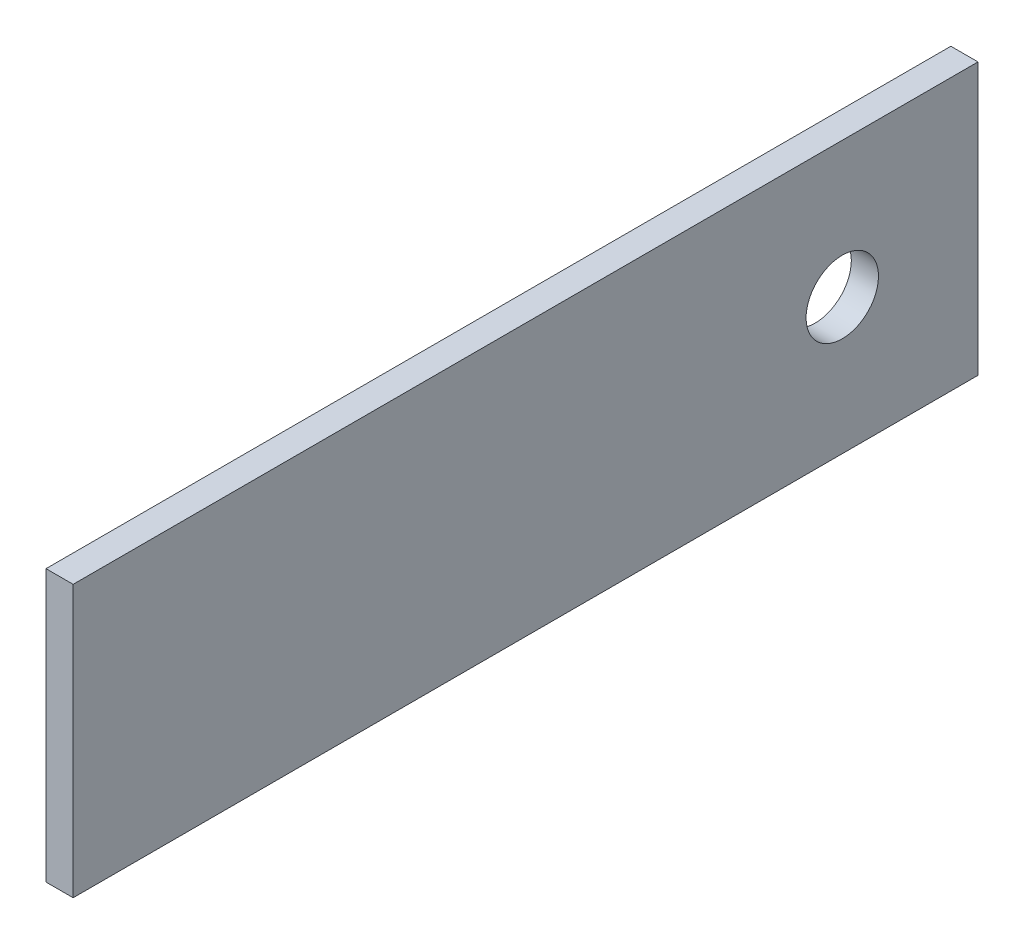
ISO-10303-21;
HEADER;
FILE_DESCRIPTION(('STEP AP214'),'2;1');
FILE_NAME('part.step','',(''),(''),'','','');
FILE_SCHEMA(('AUTOMOTIVE_DESIGN { 1 0 10303 214 1 1 1 1 }'));
ENDSEC;
DATA;
#1=APPLICATION_CONTEXT('core data for automotive mechanical design processes');
#2=APPLICATION_PROTOCOL_DEFINITION('international standard','automotive_design',2000,#1);
#3=PRODUCT_CONTEXT('',#1,'mechanical');
#4=PRODUCT('Part','Part','',(#3));
#5=PRODUCT_RELATED_PRODUCT_CATEGORY('part','',(#4));
#6=PRODUCT_DEFINITION_FORMATION('','',#4);
#7=PRODUCT_DEFINITION_CONTEXT('part definition',#1,'design');
#8=PRODUCT_DEFINITION('design','',#6,#7);
#9=PRODUCT_DEFINITION_SHAPE('','',#8);
#10=(LENGTH_UNIT() NAMED_UNIT(*) SI_UNIT(.MILLI.,.METRE.));
#11=(NAMED_UNIT(*) PLANE_ANGLE_UNIT() SI_UNIT($,.RADIAN.));
#12=(NAMED_UNIT(*) SI_UNIT($,.STERADIAN.) SOLID_ANGLE_UNIT());
#13=UNCERTAINTY_MEASURE_WITH_UNIT(LENGTH_MEASURE(1.E-05),#10,'distance_accuracy_value','');
#14=(GEOMETRIC_REPRESENTATION_CONTEXT(3) GLOBAL_UNCERTAINTY_ASSIGNED_CONTEXT((#13)) GLOBAL_UNIT_ASSIGNED_CONTEXT((#10,
#11,#12)) REPRESENTATION_CONTEXT('',''));
#15=CARTESIAN_POINT('',(0.,0.,0.));
#16=DIRECTION('',(0.,0.,1.));
#17=DIRECTION('',(1.,0.,0.));
#18=AXIS2_PLACEMENT_3D('',#15,#16,#17);
#19=CARTESIAN_POINT('',(0.,0.,100.));
#20=DIRECTION('',(0.,1.,0.));
#21=DIRECTION('',(0.,0.,1.));
#22=AXIS2_PLACEMENT_3D('',#19,#20,#21);
#23=PLANE('',#22);
#24=DIRECTION('',(1.,0.,0.));
#25=VECTOR('',#24,1.);
#26=CARTESIAN_POINT('',(0.,0.,0.));
#27=LINE('',#26,#25);
#28=CARTESIAN_POINT('',(0.,0.,0.));
#29=VERTEX_POINT('',#28);
#30=CARTESIAN_POINT('',(3.,0.,0.));
#31=VERTEX_POINT('',#30);
#32=EDGE_CURVE('E98',#29,#31,#27,.T.);
#33=ORIENTED_EDGE('',*,*,#32,.T.);
#34=DIRECTION('',(0.,0.,-1.));
#35=VECTOR('',#34,1.);
#36=CARTESIAN_POINT('',(3.,0.,100.));
#37=LINE('',#36,#35);
#38=CARTESIAN_POINT('',(3.,0.,100.));
#39=VERTEX_POINT('',#38);
#40=EDGE_CURVE('E11',#39,#31,#37,.T.);
#41=ORIENTED_EDGE('',*,*,#40,.F.);
#42=DIRECTION('',(1.,0.,0.));
#43=VECTOR('',#42,1.);
#44=CARTESIAN_POINT('',(0.,0.,100.));
#45=LINE('',#44,#43);
#46=CARTESIAN_POINT('',(0.,0.,100.));
#47=VERTEX_POINT('',#46);
#48=EDGE_CURVE('E85',#47,#39,#45,.T.);
#49=ORIENTED_EDGE('',*,*,#48,.F.);
#50=DIRECTION('',(0.,0.,-1.));
#51=VECTOR('',#50,1.);
#52=CARTESIAN_POINT('',(0.,0.,100.));
#53=LINE('',#52,#51);
#54=EDGE_CURVE('E94',#47,#29,#53,.T.);
#55=ORIENTED_EDGE('',*,*,#54,.T.);
#56=EDGE_LOOP('',(#33,#41,#49,#55));
#57=FACE_BOUND('',#56,.T.);
#58=ADVANCED_FACE('F33',(#57),#23,.F.);
#59=CARTESIAN_POINT('',(3.,30.,100.));
#60=DIRECTION('',(-1.,0.,0.));
#61=DIRECTION('',(0.,-1.,0.));
#62=AXIS2_PLACEMENT_3D('',#59,#60,#61);
#63=PLANE('',#62);
#64=CARTESIAN_POINT('',(3.,15.,15.));
#65=DIRECTION('',(1.,0.,0.));
#66=DIRECTION('',(0.,1.,0.));
#67=AXIS2_PLACEMENT_3D('',#64,#65,#66);
#68=CIRCLE('',#67,4.);
#69=CARTESIAN_POINT('',(3.,19.,15.));
#70=VERTEX_POINT('',#69);
#71=EDGE_CURVE('E111',#70,#70,#68,.T.);
#72=ORIENTED_EDGE('',*,*,#71,.F.);
#73=EDGE_LOOP('',(#72));
#74=FACE_BOUND('',#73,.T.);
#75=DIRECTION('',(0.,1.,0.));
#76=VECTOR('',#75,1.);
#77=CARTESIAN_POINT('',(3.,30.,0.));
#78=LINE('',#77,#76);
#79=CARTESIAN_POINT('',(3.,30.,0.));
#80=VERTEX_POINT('',#79);
#81=EDGE_CURVE('E89',#31,#80,#78,.T.);
#82=ORIENTED_EDGE('',*,*,#81,.T.);
#83=DIRECTION('',(0.,0.,-1.));
#84=VECTOR('',#83,1.);
#85=CARTESIAN_POINT('',(3.,30.,100.));
#86=LINE('',#85,#84);
#87=CARTESIAN_POINT('',(3.,30.,100.));
#88=VERTEX_POINT('',#87);
#89=EDGE_CURVE('E42',#88,#80,#86,.T.);
#90=ORIENTED_EDGE('',*,*,#89,.F.);
#91=DIRECTION('',(0.,1.,0.));
#92=VECTOR('',#91,1.);
#93=CARTESIAN_POINT('',(3.,30.,100.));
#94=LINE('',#93,#92);
#95=EDGE_CURVE('E80',#39,#88,#94,.T.);
#96=ORIENTED_EDGE('',*,*,#95,.F.);
#97=ORIENTED_EDGE('',*,*,#40,.T.);
#98=EDGE_LOOP('',(#82,#90,#96,#97));
#99=FACE_BOUND('',#98,.T.);
#100=ADVANCED_FACE('F88',(#74,#99),#63,.F.);
#101=CARTESIAN_POINT('',(0.,30.,100.));
#102=DIRECTION('',(0.,-1.,0.));
#103=DIRECTION('',(0.,0.,-1.));
#104=AXIS2_PLACEMENT_3D('',#101,#102,#103);
#105=PLANE('',#104);
#106=DIRECTION('',(-1.,0.,0.));
#107=VECTOR('',#106,1.);
#108=CARTESIAN_POINT('',(0.,30.,0.));
#109=LINE('',#108,#107);
#110=CARTESIAN_POINT('',(0.,30.,0.));
#111=VERTEX_POINT('',#110);
#112=EDGE_CURVE('E67',#80,#111,#109,.T.);
#113=ORIENTED_EDGE('',*,*,#112,.T.);
#114=DIRECTION('',(0.,0.,-1.));
#115=VECTOR('',#114,1.);
#116=CARTESIAN_POINT('',(0.,30.,100.));
#117=LINE('',#116,#115);
#118=CARTESIAN_POINT('',(0.,30.,100.));
#119=VERTEX_POINT('',#118);
#120=EDGE_CURVE('E90',#119,#111,#117,.T.);
#121=ORIENTED_EDGE('',*,*,#120,.F.);
#122=DIRECTION('',(-1.,0.,0.));
#123=VECTOR('',#122,1.);
#124=CARTESIAN_POINT('',(0.,30.,100.));
#125=LINE('',#124,#123);
#126=EDGE_CURVE('E83',#88,#119,#125,.T.);
#127=ORIENTED_EDGE('',*,*,#126,.F.);
#128=ORIENTED_EDGE('',*,*,#89,.T.);
#129=EDGE_LOOP('',(#113,#121,#127,#128));
#130=FACE_BOUND('',#129,.T.);
#131=ADVANCED_FACE('F92',(#130),#105,.F.);
#132=CARTESIAN_POINT('',(0.,0.,100.));
#133=DIRECTION('',(1.,0.,0.));
#134=DIRECTION('',(0.,0.,-1.));
#135=AXIS2_PLACEMENT_3D('',#132,#133,#134);
#136=PLANE('',#135);
#137=CARTESIAN_POINT('',(0.,15.,15.));
#138=DIRECTION('',(1.,0.,0.));
#139=DIRECTION('',(0.,0.,-1.));
#140=AXIS2_PLACEMENT_3D('',#137,#138,#139);
#141=CIRCLE('',#140,4.);
#142=CARTESIAN_POINT('',(0.,15.,11.));
#143=VERTEX_POINT('',#142);
#144=EDGE_CURVE('E36',#143,#143,#141,.T.);
#145=ORIENTED_EDGE('',*,*,#144,.T.);
#146=EDGE_LOOP('',(#145));
#147=FACE_BOUND('',#146,.T.);
#148=DIRECTION('',(0.,-1.,0.));
#149=VECTOR('',#148,1.);
#150=CARTESIAN_POINT('',(0.,0.,0.));
#151=LINE('',#150,#149);
#152=EDGE_CURVE('E73',#111,#29,#151,.T.);
#153=ORIENTED_EDGE('',*,*,#152,.T.);
#154=ORIENTED_EDGE('',*,*,#54,.F.);
#155=DIRECTION('',(0.,-1.,0.));
#156=VECTOR('',#155,1.);
#157=CARTESIAN_POINT('',(0.,0.,100.));
#158=LINE('',#157,#156);
#159=EDGE_CURVE('E50',#119,#47,#158,.T.);
#160=ORIENTED_EDGE('',*,*,#159,.F.);
#161=ORIENTED_EDGE('',*,*,#120,.T.);
#162=EDGE_LOOP('',(#153,#154,#160,#161));
#163=FACE_BOUND('',#162,.T.);
#164=ADVANCED_FACE('F105',(#147,#163),#136,.F.);
#165=CARTESIAN_POINT('',(0.,0.,100.));
#166=DIRECTION('',(0.,0.,-1.));
#167=DIRECTION('',(-1.,0.,0.));
#168=AXIS2_PLACEMENT_3D('',#165,#166,#167);
#169=PLANE('',#168);
#170=ORIENTED_EDGE('',*,*,#48,.T.);
#171=ORIENTED_EDGE('',*,*,#95,.T.);
#172=ORIENTED_EDGE('',*,*,#126,.T.);
#173=ORIENTED_EDGE('',*,*,#159,.T.);
#174=EDGE_LOOP('',(#170,#171,#172,#173));
#175=FACE_BOUND('',#174,.T.);
#176=ADVANCED_FACE('F81',(#175),#169,.F.);
#177=CARTESIAN_POINT('',(0.,0.,0.));
#178=DIRECTION('',(0.,0.,-1.));
#179=DIRECTION('',(-1.,0.,0.));
#180=AXIS2_PLACEMENT_3D('',#177,#178,#179);
#181=PLANE('',#180);
#182=ORIENTED_EDGE('',*,*,#32,.F.);
#183=ORIENTED_EDGE('',*,*,#152,.F.);
#184=ORIENTED_EDGE('',*,*,#112,.F.);
#185=ORIENTED_EDGE('',*,*,#81,.F.);
#186=EDGE_LOOP('',(#182,#183,#184,#185));
#187=FACE_BOUND('',#186,.T.);
#188=ADVANCED_FACE('F108',(#187),#181,.T.);
#189=CARTESIAN_POINT('',(-7.,15.,15.));
#190=DIRECTION('',(1.,0.,0.));
#191=DIRECTION('',(0.,1.,0.));
#192=AXIS2_PLACEMENT_3D('',#189,#190,#191);
#193=CYLINDRICAL_SURFACE('',#192,4.);
#194=ORIENTED_EDGE('',*,*,#71,.T.);
#195=EDGE_LOOP('',(#194));
#196=FACE_BOUND('',#195,.T.);
#197=ORIENTED_EDGE('',*,*,#144,.F.);
#198=EDGE_LOOP('',(#197));
#199=FACE_BOUND('',#198,.T.);
#200=ADVANCED_FACE('F119',(#196,#199),#193,.F.);
#201=CLOSED_SHELL('',(#58,#100,#131,#164,#176,#188,#200));
#202=MANIFOLD_SOLID_BREP('B2',#201);
#203=ADVANCED_BREP_SHAPE_REPRESENTATION('',(#18,#202),#14);
#204=SHAPE_DEFINITION_REPRESENTATION(#9,#203);
ENDSEC;
END-ISO-10303-21;
